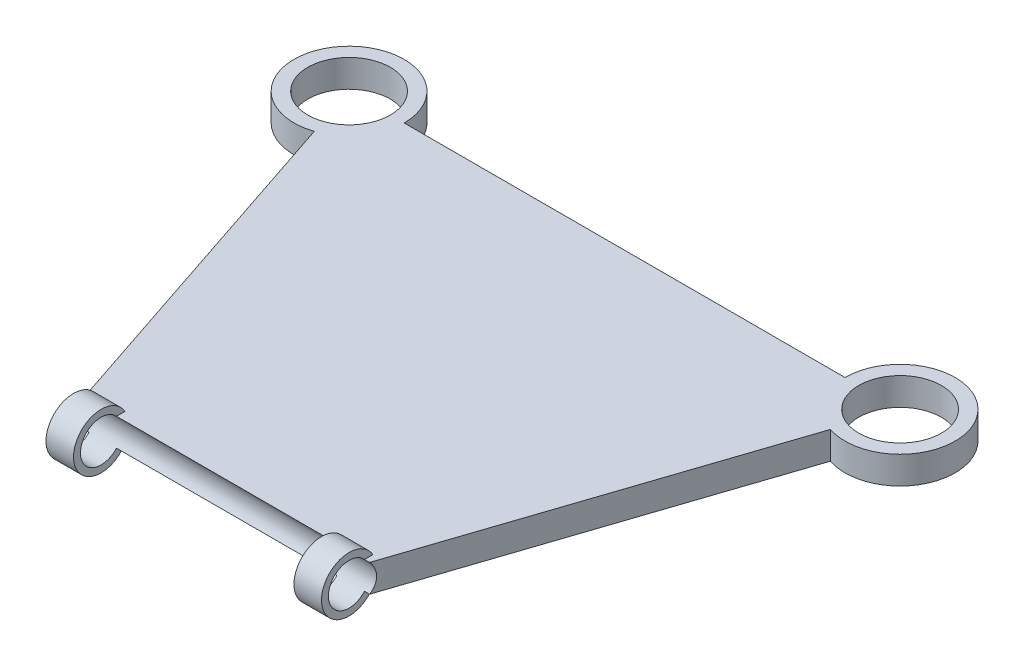
ISO-10303-21;
HEADER;
FILE_DESCRIPTION(('STEP AP214'),'2;1');
FILE_NAME('part.step','',(''),(''),'','','');
FILE_SCHEMA(('AUTOMOTIVE_DESIGN { 1 0 10303 214 1 1 1 1 }'));
ENDSEC;
DATA;
#1=APPLICATION_CONTEXT('core data for automotive mechanical design processes');
#2=APPLICATION_PROTOCOL_DEFINITION('international standard','automotive_design',2000,#1);
#3=PRODUCT_CONTEXT('',#1,'mechanical');
#4=PRODUCT('Part','Part','',(#3));
#5=PRODUCT_RELATED_PRODUCT_CATEGORY('part','',(#4));
#6=PRODUCT_DEFINITION_FORMATION('','',#4);
#7=PRODUCT_DEFINITION_CONTEXT('part definition',#1,'design');
#8=PRODUCT_DEFINITION('design','',#6,#7);
#9=PRODUCT_DEFINITION_SHAPE('','',#8);
#10=(LENGTH_UNIT() NAMED_UNIT(*) SI_UNIT(.MILLI.,.METRE.));
#11=(NAMED_UNIT(*) PLANE_ANGLE_UNIT() SI_UNIT($,.RADIAN.));
#12=(NAMED_UNIT(*) SI_UNIT($,.STERADIAN.) SOLID_ANGLE_UNIT());
#13=UNCERTAINTY_MEASURE_WITH_UNIT(LENGTH_MEASURE(1.E-05),#10,'distance_accuracy_value','');
#14=(GEOMETRIC_REPRESENTATION_CONTEXT(3) GLOBAL_UNCERTAINTY_ASSIGNED_CONTEXT((#13)) GLOBAL_UNIT_ASSIGNED_CONTEXT((#10,
#11,#12)) REPRESENTATION_CONTEXT('',''));
#15=CARTESIAN_POINT('',(0.,0.,0.));
#16=DIRECTION('',(0.,0.,1.));
#17=DIRECTION('',(1.,0.,0.));
#18=AXIS2_PLACEMENT_3D('',#15,#16,#17);
#19=CARTESIAN_POINT('',(0.,32.,0.));
#20=DIRECTION('',(0.,1.,0.));
#21=DIRECTION('',(0.,0.,1.));
#22=AXIS2_PLACEMENT_3D('',#19,#20,#21);
#23=PLANE('',#22);
#24=CARTESIAN_POINT('',(640.,32.,0.));
#25=DIRECTION('',(0.,1.,0.));
#26=DIRECTION('',(0.,0.,1.));
#27=AXIS2_PLACEMENT_3D('',#24,#25,#26);
#28=CIRCLE('',#27,48.);
#29=CARTESIAN_POINT('',(640.,32.,48.));
#30=VERTEX_POINT('',#29);
#31=EDGE_CURVE('E217',#30,#30,#28,.T.);
#32=ORIENTED_EDGE('',*,*,#31,.F.);
#33=EDGE_LOOP('',(#32));
#34=FACE_BOUND('',#33,.T.);
#35=CARTESIAN_POINT('',(0.,32.,0.));
#36=DIRECTION('',(0.,1.,0.));
#37=DIRECTION('',(0.,0.,1.));
#38=AXIS2_PLACEMENT_3D('',#35,#36,#37);
#39=CIRCLE('',#38,48.);
#40=CARTESIAN_POINT('',(0.,32.,48.));
#41=VERTEX_POINT('',#40);
#42=EDGE_CURVE('E221',#41,#41,#39,.T.);
#43=ORIENTED_EDGE('',*,*,#42,.F.);
#44=EDGE_LOOP('',(#43));
#45=FACE_BOUND('',#44,.T.);
#46=DIRECTION('',(-0.316227766016838,0.,-0.948683298050514));
#47=VECTOR('',#46,1.);
#48=CARTESIAN_POINT('',(0.,32.,0.));
#49=LINE('',#48,#47);
#50=CARTESIAN_POINT('',(154.037152060001,32.,462.111456180002));
#51=VERTEX_POINT('',#50);
#52=CARTESIAN_POINT('',(20.2385770250776,32.,60.7157310752329));
#53=VERTEX_POINT('',#52);
#54=EDGE_CURVE('E240',#51,#53,#49,.T.);
#55=ORIENTED_EDGE('',*,*,#54,.F.);
#56=DIRECTION('',(1.,0.,0.));
#57=VECTOR('',#56,1.);
#58=CARTESIAN_POINT('',(128.,32.,462.111456180002));
#59=LINE('',#58,#57);
#60=CARTESIAN_POINT('',(160.,32.,462.111456180002));
#61=VERTEX_POINT('',#60);
#62=EDGE_CURVE('E57',#51,#61,#59,.T.);
#63=ORIENTED_EDGE('',*,*,#62,.T.);
#64=DIRECTION('',(0.,0.,1.));
#65=VECTOR('',#64,1.);
#66=CARTESIAN_POINT('',(160.,32.,0.));
#67=LINE('',#66,#65);
#68=CARTESIAN_POINT('',(160.,32.,452.287187078898));
#69=VERTEX_POINT('',#68);
#70=EDGE_CURVE('E202',#69,#61,#67,.T.);
#71=ORIENTED_EDGE('',*,*,#70,.F.);
#72=DIRECTION('',(-1.,0.,0.));
#73=VECTOR('',#72,1.);
#74=CARTESIAN_POINT('',(192.,32.,452.287187078898));
#75=LINE('',#74,#73);
#76=CARTESIAN_POINT('',(192.,32.,452.287187078898));
#77=VERTEX_POINT('',#76);
#78=EDGE_CURVE('E213',#77,#69,#75,.T.);
#79=ORIENTED_EDGE('',*,*,#78,.F.);
#80=DIRECTION('',(0.,0.,1.));
#81=VECTOR('',#80,1.);
#82=CARTESIAN_POINT('',(192.,32.,0.));
#83=LINE('',#82,#81);
#84=CARTESIAN_POINT('',(192.,32.,462.111456180002));
#85=VERTEX_POINT('',#84);
#86=EDGE_CURVE('E209',#77,#85,#83,.T.);
#87=ORIENTED_EDGE('',*,*,#86,.T.);
#88=CARTESIAN_POINT('',(448.,32.,462.111456180002));
#89=VERTEX_POINT('',#88);
#90=EDGE_CURVE('E156',#85,#89,#59,.T.);
#91=ORIENTED_EDGE('',*,*,#90,.T.);
#92=DIRECTION('',(0.,0.,1.));
#93=VECTOR('',#92,1.);
#94=CARTESIAN_POINT('',(448.,32.,0.));
#95=LINE('',#94,#93);
#96=CARTESIAN_POINT('',(448.,32.,452.287187078898));
#97=VERTEX_POINT('',#96);
#98=EDGE_CURVE('E65',#97,#89,#95,.T.);
#99=ORIENTED_EDGE('',*,*,#98,.F.);
#100=DIRECTION('',(1.,0.,0.));
#101=VECTOR('',#100,1.);
#102=CARTESIAN_POINT('',(448.,32.,452.287187078898));
#103=LINE('',#102,#101);
#104=CARTESIAN_POINT('',(480.,32.,452.287187078898));
#105=VERTEX_POINT('',#104);
#106=EDGE_CURVE('E160',#97,#105,#103,.T.);
#107=ORIENTED_EDGE('',*,*,#106,.T.);
#108=DIRECTION('',(0.,0.,1.));
#109=VECTOR('',#108,1.);
#110=CARTESIAN_POINT('',(480.,32.,0.));
#111=LINE('',#110,#109);
#112=CARTESIAN_POINT('',(480.,32.,462.111456180002));
#113=VERTEX_POINT('',#112);
#114=EDGE_CURVE('E158',#105,#113,#111,.T.);
#115=ORIENTED_EDGE('',*,*,#114,.T.);
#116=CARTESIAN_POINT('',(485.96284794,32.,462.111456180002));
#117=VERTEX_POINT('',#116);
#118=EDGE_CURVE('E142',#113,#117,#59,.T.);
#119=ORIENTED_EDGE('',*,*,#118,.T.);
#120=DIRECTION('',(-0.316227766016838,0.,0.948683298050514));
#121=VECTOR('',#120,1.);
#122=CARTESIAN_POINT('',(576.,32.,192.));
#123=LINE('',#122,#121);
#124=CARTESIAN_POINT('',(619.761422974923,32.,60.7157310752329));
#125=VERTEX_POINT('',#124);
#126=EDGE_CURVE('E226',#125,#117,#123,.T.);
#127=ORIENTED_EDGE('',*,*,#126,.F.);
#128=CARTESIAN_POINT('',(640.,32.,0.));
#129=DIRECTION('',(0.,1.,0.));
#130=DIRECTION('',(0.,0.,1.));
#131=AXIS2_PLACEMENT_3D('',#128,#129,#130);
#132=CIRCLE('',#131,64.);
#133=CARTESIAN_POINT('',(576.,32.,0.));
#134=VERTEX_POINT('',#133);
#135=EDGE_CURVE('E229',#125,#134,#132,.T.);
#136=ORIENTED_EDGE('',*,*,#135,.T.);
#137=DIRECTION('',(1.,0.,0.));
#138=VECTOR('',#137,1.);
#139=CARTESIAN_POINT('',(0.,32.,0.));
#140=LINE('',#139,#138);
#141=CARTESIAN_POINT('',(64.,32.,0.));
#142=VERTEX_POINT('',#141);
#143=EDGE_CURVE('E232',#142,#134,#140,.T.);
#144=ORIENTED_EDGE('',*,*,#143,.F.);
#145=CARTESIAN_POINT('',(0.,32.,0.));
#146=DIRECTION('',(0.,1.,0.));
#147=DIRECTION('',(0.,0.,1.));
#148=AXIS2_PLACEMENT_3D('',#145,#146,#147);
#149=CIRCLE('',#148,64.);
#150=EDGE_CURVE('E236',#142,#53,#149,.T.);
#151=ORIENTED_EDGE('',*,*,#150,.T.);
#152=EDGE_LOOP('',(#55,#63,#71,#79,#87,#91,#99,#107,#115,#119,#127,#136,#144,#151));
#153=FACE_BOUND('',#152,.T.);
#154=ADVANCED_FACE('F41',(#34,#45,#153),#23,.T.);
#155=CARTESIAN_POINT('',(0.,0.,0.));
#156=DIRECTION('',(0.,1.,0.));
#157=DIRECTION('',(0.,0.,1.));
#158=AXIS2_PLACEMENT_3D('',#155,#156,#157);
#159=PLANE('',#158);
#160=CARTESIAN_POINT('',(640.,0.,0.));
#161=DIRECTION('',(0.,1.,0.));
#162=DIRECTION('',(0.,0.,1.));
#163=AXIS2_PLACEMENT_3D('',#160,#161,#162);
#164=CIRCLE('',#163,48.);
#165=CARTESIAN_POINT('',(640.,0.,48.));
#166=VERTEX_POINT('',#165);
#167=EDGE_CURVE('E216',#166,#166,#164,.T.);
#168=ORIENTED_EDGE('',*,*,#167,.T.);
#169=EDGE_LOOP('',(#168));
#170=FACE_BOUND('',#169,.T.);
#171=CARTESIAN_POINT('',(0.,0.,0.));
#172=DIRECTION('',(0.,1.,0.));
#173=DIRECTION('',(0.,0.,1.));
#174=AXIS2_PLACEMENT_3D('',#171,#172,#173);
#175=CIRCLE('',#174,48.);
#176=CARTESIAN_POINT('',(0.,0.,48.));
#177=VERTEX_POINT('',#176);
#178=EDGE_CURVE('E247',#177,#177,#175,.T.);
#179=ORIENTED_EDGE('',*,*,#178,.T.);
#180=EDGE_LOOP('',(#179));
#181=FACE_BOUND('',#180,.T.);
#182=DIRECTION('',(1.,0.,0.));
#183=VECTOR('',#182,1.);
#184=CARTESIAN_POINT('',(128.,0.,462.111456180002));
#185=LINE('',#184,#183);
#186=CARTESIAN_POINT('',(154.037152060001,0.,462.111456180002));
#187=VERTEX_POINT('',#186);
#188=CARTESIAN_POINT('',(160.,0.,462.111456180002));
#189=VERTEX_POINT('',#188);
#190=EDGE_CURVE('E177',#187,#189,#185,.T.);
#191=ORIENTED_EDGE('',*,*,#190,.F.);
#192=DIRECTION('',(-0.316227766016838,0.,-0.948683298050514));
#193=VECTOR('',#192,1.);
#194=CARTESIAN_POINT('',(0.,0.,0.));
#195=LINE('',#194,#193);
#196=CARTESIAN_POINT('',(20.2385770250776,0.,60.7157310752329));
#197=VERTEX_POINT('',#196);
#198=EDGE_CURVE('E222',#187,#197,#195,.T.);
#199=ORIENTED_EDGE('',*,*,#198,.T.);
#200=CARTESIAN_POINT('',(0.,0.,0.));
#201=DIRECTION('',(0.,1.,0.));
#202=DIRECTION('',(0.,0.,1.));
#203=AXIS2_PLACEMENT_3D('',#200,#201,#202);
#204=CIRCLE('',#203,64.);
#205=CARTESIAN_POINT('',(64.,0.,0.));
#206=VERTEX_POINT('',#205);
#207=EDGE_CURVE('E263',#206,#197,#204,.T.);
#208=ORIENTED_EDGE('',*,*,#207,.F.);
#209=DIRECTION('',(1.,0.,0.));
#210=VECTOR('',#209,1.);
#211=CARTESIAN_POINT('',(0.,0.,0.));
#212=LINE('',#211,#210);
#213=CARTESIAN_POINT('',(576.,0.,0.));
#214=VERTEX_POINT('',#213);
#215=EDGE_CURVE('E259',#206,#214,#212,.T.);
#216=ORIENTED_EDGE('',*,*,#215,.T.);
#217=CARTESIAN_POINT('',(640.,0.,0.));
#218=DIRECTION('',(0.,1.,0.));
#219=DIRECTION('',(0.,0.,1.));
#220=AXIS2_PLACEMENT_3D('',#217,#218,#219);
#221=CIRCLE('',#220,64.);
#222=CARTESIAN_POINT('',(619.761422974923,0.,60.7157310752329));
#223=VERTEX_POINT('',#222);
#224=EDGE_CURVE('E255',#223,#214,#221,.T.);
#225=ORIENTED_EDGE('',*,*,#224,.F.);
#226=DIRECTION('',(-0.316227766016838,0.,0.948683298050514));
#227=VECTOR('',#226,1.);
#228=CARTESIAN_POINT('',(576.,0.,192.));
#229=LINE('',#228,#227);
#230=CARTESIAN_POINT('',(485.96284794,0.,462.111456180002));
#231=VERTEX_POINT('',#230);
#232=EDGE_CURVE('E251',#223,#231,#229,.T.);
#233=ORIENTED_EDGE('',*,*,#232,.T.);
#234=CARTESIAN_POINT('',(480.,0.,462.111456180002));
#235=VERTEX_POINT('',#234);
#236=EDGE_CURVE('E154',#235,#231,#185,.T.);
#237=ORIENTED_EDGE('',*,*,#236,.F.);
#238=DIRECTION('',(0.,0.,1.));
#239=VECTOR('',#238,1.);
#240=CARTESIAN_POINT('',(480.,0.,0.));
#241=LINE('',#240,#239);
#242=CARTESIAN_POINT('',(480.,0.,452.287187078898));
#243=VERTEX_POINT('',#242);
#244=EDGE_CURVE('E168',#243,#235,#241,.T.);
#245=ORIENTED_EDGE('',*,*,#244,.F.);
#246=DIRECTION('',(1.,0.,0.));
#247=VECTOR('',#246,1.);
#248=CARTESIAN_POINT('',(448.,0.,452.287187078898));
#249=LINE('',#248,#247);
#250=CARTESIAN_POINT('',(448.,0.,452.287187078898));
#251=VERTEX_POINT('',#250);
#252=EDGE_CURVE('E11',#251,#243,#249,.T.);
#253=ORIENTED_EDGE('',*,*,#252,.F.);
#254=DIRECTION('',(0.,0.,1.));
#255=VECTOR('',#254,1.);
#256=CARTESIAN_POINT('',(448.,0.,0.));
#257=LINE('',#256,#255);
#258=CARTESIAN_POINT('',(448.,0.,462.111456180002));
#259=VERTEX_POINT('',#258);
#260=EDGE_CURVE('E50',#251,#259,#257,.T.);
#261=ORIENTED_EDGE('',*,*,#260,.T.);
#262=CARTESIAN_POINT('',(192.,0.,462.111456180002));
#263=VERTEX_POINT('',#262);
#264=EDGE_CURVE('E299',#263,#259,#185,.T.);
#265=ORIENTED_EDGE('',*,*,#264,.F.);
#266=DIRECTION('',(0.,0.,1.));
#267=VECTOR('',#266,1.);
#268=CARTESIAN_POINT('',(192.,0.,0.));
#269=LINE('',#268,#267);
#270=CARTESIAN_POINT('',(192.,0.,452.287187078898));
#271=VERTEX_POINT('',#270);
#272=EDGE_CURVE('E285',#271,#263,#269,.T.);
#273=ORIENTED_EDGE('',*,*,#272,.F.);
#274=DIRECTION('',(-1.,0.,0.));
#275=VECTOR('',#274,1.);
#276=CARTESIAN_POINT('',(192.,0.,452.287187078898));
#277=LINE('',#276,#275);
#278=CARTESIAN_POINT('',(160.,0.,452.287187078898));
#279=VERTEX_POINT('',#278);
#280=EDGE_CURVE('E289',#271,#279,#277,.T.);
#281=ORIENTED_EDGE('',*,*,#280,.T.);
#282=DIRECTION('',(0.,0.,1.));
#283=VECTOR('',#282,1.);
#284=CARTESIAN_POINT('',(160.,0.,0.));
#285=LINE('',#284,#283);
#286=EDGE_CURVE('E281',#279,#189,#285,.T.);
#287=ORIENTED_EDGE('',*,*,#286,.T.);
#288=EDGE_LOOP('',(#191,#199,#208,#216,#225,#233,#237,#245,#253,#261,#265,#273,#281,#287));
#289=FACE_BOUND('',#288,.T.);
#290=ADVANCED_FACE('F298',(#170,#181,#289),#159,.F.);
#291=CARTESIAN_POINT('',(576.,32.,192.));
#292=DIRECTION('',(0.948683298050514,0.,0.316227766016838));
#293=DIRECTION('',(0.316227766016838,0.,-0.948683298050514));
#294=AXIS2_PLACEMENT_3D('',#291,#292,#293);
#295=PLANE('',#294);
#296=ORIENTED_EDGE('',*,*,#126,.T.);
#297=CARTESIAN_POINT('',(480.,16.,480.));
#298=DIRECTION('',(0.948683298050514,0.,0.316227766016838));
#299=DIRECTION('',(0.316227766016838,0.,-0.948683298050514));
#300=AXIS2_PLACEMENT_3D('',#297,#298,#299);
#301=ELLIPSE('',#300,25.298221281347,24.);
#302=EDGE_CURVE('E150',#117,#231,#301,.F.);
#303=ORIENTED_EDGE('',*,*,#302,.T.);
#304=ORIENTED_EDGE('',*,*,#232,.F.);
#305=DIRECTION('',(0.,-1.,0.));
#306=VECTOR('',#305,1.);
#307=CARTESIAN_POINT('',(619.761422974923,32.,60.7157310752329));
#308=LINE('',#307,#306);
#309=EDGE_CURVE('E278',#125,#223,#308,.T.);
#310=ORIENTED_EDGE('',*,*,#309,.F.);
#311=EDGE_LOOP('',(#296,#303,#304,#310));
#312=FACE_BOUND('',#311,.T.);
#313=ADVANCED_FACE('F336',(#312),#295,.T.);
#314=CARTESIAN_POINT('',(640.,32.,0.));
#315=DIRECTION('',(0.,-1.,0.));
#316=DIRECTION('',(0.,0.,-1.));
#317=AXIS2_PLACEMENT_3D('',#314,#315,#316);
#318=CYLINDRICAL_SURFACE('',#317,64.);
#319=ORIENTED_EDGE('',*,*,#224,.T.);
#320=DIRECTION('',(0.,-1.,0.));
#321=VECTOR('',#320,1.);
#322=CARTESIAN_POINT('',(576.,32.,0.));
#323=LINE('',#322,#321);
#324=EDGE_CURVE('E275',#134,#214,#323,.T.);
#325=ORIENTED_EDGE('',*,*,#324,.F.);
#326=ORIENTED_EDGE('',*,*,#135,.F.);
#327=ORIENTED_EDGE('',*,*,#309,.T.);
#328=EDGE_LOOP('',(#319,#325,#326,#327));
#329=FACE_BOUND('',#328,.T.);
#330=ADVANCED_FACE('F335',(#329),#318,.T.);
#331=CARTESIAN_POINT('',(0.,32.,0.));
#332=DIRECTION('',(0.,0.,-1.));
#333=DIRECTION('',(-1.,0.,0.));
#334=AXIS2_PLACEMENT_3D('',#331,#332,#333);
#335=PLANE('',#334);
#336=ORIENTED_EDGE('',*,*,#215,.F.);
#337=DIRECTION('',(0.,-1.,0.));
#338=VECTOR('',#337,1.);
#339=CARTESIAN_POINT('',(64.,32.,0.));
#340=LINE('',#339,#338);
#341=EDGE_CURVE('E272',#142,#206,#340,.T.);
#342=ORIENTED_EDGE('',*,*,#341,.F.);
#343=ORIENTED_EDGE('',*,*,#143,.T.);
#344=ORIENTED_EDGE('',*,*,#324,.T.);
#345=EDGE_LOOP('',(#336,#342,#343,#344));
#346=FACE_BOUND('',#345,.T.);
#347=ADVANCED_FACE('F331',(#346),#335,.T.);
#348=CARTESIAN_POINT('',(0.,32.,0.));
#349=DIRECTION('',(0.,-1.,0.));
#350=DIRECTION('',(0.,0.,-1.));
#351=AXIS2_PLACEMENT_3D('',#348,#349,#350);
#352=CYLINDRICAL_SURFACE('',#351,64.);
#353=ORIENTED_EDGE('',*,*,#207,.T.);
#354=DIRECTION('',(0.,-1.,0.));
#355=VECTOR('',#354,1.);
#356=CARTESIAN_POINT('',(20.2385770250776,32.,60.7157310752329));
#357=LINE('',#356,#355);
#358=EDGE_CURVE('E243',#53,#197,#357,.T.);
#359=ORIENTED_EDGE('',*,*,#358,.F.);
#360=ORIENTED_EDGE('',*,*,#150,.F.);
#361=ORIENTED_EDGE('',*,*,#341,.T.);
#362=EDGE_LOOP('',(#353,#359,#360,#361));
#363=FACE_BOUND('',#362,.T.);
#364=ADVANCED_FACE('F327',(#363),#352,.T.);
#365=CARTESIAN_POINT('',(0.,32.,0.));
#366=DIRECTION('',(-0.948683298050514,0.,0.316227766016838));
#367=DIRECTION('',(0.316227766016838,0.,0.948683298050514));
#368=AXIS2_PLACEMENT_3D('',#365,#366,#367);
#369=PLANE('',#368);
#370=ORIENTED_EDGE('',*,*,#198,.F.);
#371=CARTESIAN_POINT('',(160.,16.,480.));
#372=DIRECTION('',(-0.948683298050514,0.,0.316227766016838));
#373=DIRECTION('',(0.316227766016838,0.,0.948683298050514));
#374=AXIS2_PLACEMENT_3D('',#371,#372,#373);
#375=ELLIPSE('',#374,25.298221281347,24.);
#376=EDGE_CURVE('E311',#187,#51,#375,.F.);
#377=ORIENTED_EDGE('',*,*,#376,.T.);
#378=ORIENTED_EDGE('',*,*,#54,.T.);
#379=ORIENTED_EDGE('',*,*,#358,.T.);
#380=EDGE_LOOP('',(#370,#377,#378,#379));
#381=FACE_BOUND('',#380,.T.);
#382=ADVANCED_FACE('F321',(#381),#369,.T.);
#383=CARTESIAN_POINT('',(0.,32.,0.));
#384=DIRECTION('',(0.,-1.,0.));
#385=DIRECTION('',(0.,0.,-1.));
#386=AXIS2_PLACEMENT_3D('',#383,#384,#385);
#387=CYLINDRICAL_SURFACE('',#386,48.);
#388=ORIENTED_EDGE('',*,*,#42,.T.);
#389=EDGE_LOOP('',(#388));
#390=FACE_BOUND('',#389,.T.);
#391=ORIENTED_EDGE('',*,*,#178,.F.);
#392=EDGE_LOOP('',(#391));
#393=FACE_BOUND('',#392,.T.);
#394=ADVANCED_FACE('F360',(#390,#393),#387,.F.);
#395=CARTESIAN_POINT('',(640.,32.,0.));
#396=DIRECTION('',(0.,-1.,0.));
#397=DIRECTION('',(0.,0.,-1.));
#398=AXIS2_PLACEMENT_3D('',#395,#396,#397);
#399=CYLINDRICAL_SURFACE('',#398,48.);
#400=ORIENTED_EDGE('',*,*,#31,.T.);
#401=EDGE_LOOP('',(#400));
#402=FACE_BOUND('',#401,.T.);
#403=ORIENTED_EDGE('',*,*,#167,.F.);
#404=EDGE_LOOP('',(#403));
#405=FACE_BOUND('',#404,.T.);
#406=ADVANCED_FACE('F43',(#402,#405),#399,.F.);
#407=CARTESIAN_POINT('',(192.,16.,480.));
#408=DIRECTION('',(-1.,0.,0.));
#409=DIRECTION('',(0.,0.,1.));
#410=AXIS2_PLACEMENT_3D('',#407,#408,#409);
#411=CYLINDRICAL_SURFACE('',#410,32.);
#412=CARTESIAN_POINT('',(192.,16.,480.));
#413=DIRECTION('',(-1.,0.,0.));
#414=DIRECTION('',(0.,0.,1.));
#415=AXIS2_PLACEMENT_3D('',#412,#413,#414);
#416=CIRCLE('',#415,32.);
#417=EDGE_CURVE('E198',#271,#77,#416,.T.);
#418=ORIENTED_EDGE('',*,*,#417,.T.);
#419=ORIENTED_EDGE('',*,*,#78,.T.);
#420=CARTESIAN_POINT('',(160.,16.,480.));
#421=DIRECTION('',(-1.,0.,0.));
#422=DIRECTION('',(0.,0.,1.));
#423=AXIS2_PLACEMENT_3D('',#420,#421,#422);
#424=CIRCLE('',#423,32.);
#425=EDGE_CURVE('E195',#279,#69,#424,.T.);
#426=ORIENTED_EDGE('',*,*,#425,.F.);
#427=ORIENTED_EDGE('',*,*,#280,.F.);
#428=EDGE_LOOP('',(#418,#419,#426,#427));
#429=FACE_BOUND('',#428,.T.);
#430=ADVANCED_FACE('F356',(#429),#411,.T.);
#431=CARTESIAN_POINT('',(192.,16.,480.));
#432=DIRECTION('',(-1.,0.,0.));
#433=DIRECTION('',(0.,0.,1.));
#434=AXIS2_PLACEMENT_3D('',#431,#432,#433);
#435=PLANE('',#434);
#436=ORIENTED_EDGE('',*,*,#86,.F.);
#437=ORIENTED_EDGE('',*,*,#417,.F.);
#438=ORIENTED_EDGE('',*,*,#272,.T.);
#439=CARTESIAN_POINT('',(192.,16.,480.));
#440=DIRECTION('',(-1.,0.,0.));
#441=DIRECTION('',(0.,0.,1.));
#442=AXIS2_PLACEMENT_3D('',#439,#440,#441);
#443=CIRCLE('',#442,24.);
#444=EDGE_CURVE('E191',#263,#85,#443,.T.);
#445=ORIENTED_EDGE('',*,*,#444,.T.);
#446=EDGE_LOOP('',(#436,#437,#438,#445));
#447=FACE_BOUND('',#446,.T.);
#448=ADVANCED_FACE('F411',(#447),#435,.F.);
#449=CARTESIAN_POINT('',(160.,16.,480.));
#450=DIRECTION('',(-1.,0.,0.));
#451=DIRECTION('',(0.,0.,1.));
#452=AXIS2_PLACEMENT_3D('',#449,#450,#451);
#453=PLANE('',#452);
#454=ORIENTED_EDGE('',*,*,#425,.T.);
#455=ORIENTED_EDGE('',*,*,#70,.T.);
#456=CARTESIAN_POINT('',(160.,16.,480.));
#457=DIRECTION('',(-1.,0.,0.));
#458=DIRECTION('',(0.,0.,1.));
#459=AXIS2_PLACEMENT_3D('',#456,#457,#458);
#460=CIRCLE('',#459,24.);
#461=EDGE_CURVE('E190',#189,#61,#460,.T.);
#462=ORIENTED_EDGE('',*,*,#461,.F.);
#463=ORIENTED_EDGE('',*,*,#286,.F.);
#464=EDGE_LOOP('',(#454,#455,#462,#463));
#465=FACE_BOUND('',#464,.T.);
#466=ADVANCED_FACE('F417',(#465),#453,.T.);
#467=CARTESIAN_POINT('',(192.,16.,480.));
#468=DIRECTION('',(-1.,0.,0.));
#469=DIRECTION('',(0.,0.,1.));
#470=AXIS2_PLACEMENT_3D('',#467,#468,#469);
#471=CYLINDRICAL_SURFACE('',#470,24.);
#472=ORIENTED_EDGE('',*,*,#461,.T.);
#473=ORIENTED_EDGE('',*,*,#62,.F.);
#474=ORIENTED_EDGE('',*,*,#376,.F.);
#475=ORIENTED_EDGE('',*,*,#190,.T.);
#476=EDGE_LOOP('',(#472,#473,#474,#475));
#477=FACE_BOUND('',#476,.T.);
#478=ORIENTED_EDGE('',*,*,#118,.F.);
#479=CARTESIAN_POINT('',(480.,16.,480.));
#480=DIRECTION('',(-1.,0.,0.));
#481=DIRECTION('',(0.,0.,1.));
#482=AXIS2_PLACEMENT_3D('',#479,#480,#481);
#483=CIRCLE('',#482,24.0000000000001);
#484=EDGE_CURVE('E147',#235,#113,#483,.T.);
#485=ORIENTED_EDGE('',*,*,#484,.F.);
#486=ORIENTED_EDGE('',*,*,#236,.T.);
#487=ORIENTED_EDGE('',*,*,#302,.F.);
#488=EDGE_LOOP('',(#478,#485,#486,#487));
#489=FACE_BOUND('',#488,.T.);
#490=ORIENTED_EDGE('',*,*,#90,.F.);
#491=ORIENTED_EDGE('',*,*,#444,.F.);
#492=ORIENTED_EDGE('',*,*,#264,.T.);
#493=CARTESIAN_POINT('',(448.,16.,480.));
#494=DIRECTION('',(-1.,0.,0.));
#495=DIRECTION('',(0.,0.,1.));
#496=AXIS2_PLACEMENT_3D('',#493,#494,#495);
#497=CIRCLE('',#496,24.0000000000001);
#498=EDGE_CURVE('E170',#259,#89,#497,.T.);
#499=ORIENTED_EDGE('',*,*,#498,.T.);
#500=EDGE_LOOP('',(#490,#491,#492,#499));
#501=FACE_BOUND('',#500,.T.);
#502=ADVANCED_FACE('F144',(#477,#489,#501),#471,.F.);
#503=CARTESIAN_POINT('',(448.,16.,480.));
#504=DIRECTION('',(-1.,0.,0.));
#505=DIRECTION('',(0.,0.,1.));
#506=AXIS2_PLACEMENT_3D('',#503,#504,#505);
#507=PLANE('',#506);
#508=CARTESIAN_POINT('',(448.,16.,480.));
#509=DIRECTION('',(-1.,0.,0.));
#510=DIRECTION('',(0.,0.,1.));
#511=AXIS2_PLACEMENT_3D('',#508,#509,#510);
#512=CIRCLE('',#511,32.0000000000001);
#513=EDGE_CURVE('E180',#251,#97,#512,.T.);
#514=ORIENTED_EDGE('',*,*,#513,.T.);
#515=ORIENTED_EDGE('',*,*,#98,.T.);
#516=ORIENTED_EDGE('',*,*,#498,.F.);
#517=ORIENTED_EDGE('',*,*,#260,.F.);
#518=EDGE_LOOP('',(#514,#515,#516,#517));
#519=FACE_BOUND('',#518,.T.);
#520=ADVANCED_FACE('F303',(#519),#507,.T.);
#521=CARTESIAN_POINT('',(480.,16.,480.));
#522=DIRECTION('',(-1.,0.,0.));
#523=DIRECTION('',(0.,0.,1.));
#524=AXIS2_PLACEMENT_3D('',#521,#522,#523);
#525=PLANE('',#524);
#526=ORIENTED_EDGE('',*,*,#114,.F.);
#527=CARTESIAN_POINT('',(480.,16.,480.));
#528=DIRECTION('',(-1.,0.,0.));
#529=DIRECTION('',(0.,0.,1.));
#530=AXIS2_PLACEMENT_3D('',#527,#528,#529);
#531=CIRCLE('',#530,32.0000000000001);
#532=EDGE_CURVE('E175',#243,#105,#531,.T.);
#533=ORIENTED_EDGE('',*,*,#532,.F.);
#534=ORIENTED_EDGE('',*,*,#244,.T.);
#535=ORIENTED_EDGE('',*,*,#484,.T.);
#536=EDGE_LOOP('',(#526,#533,#534,#535));
#537=FACE_BOUND('',#536,.T.);
#538=ADVANCED_FACE('F166',(#537),#525,.F.);
#539=CARTESIAN_POINT('',(448.,16.,480.));
#540=DIRECTION('',(1.,0.,0.));
#541=DIRECTION('',(0.,0.,-1.));
#542=AXIS2_PLACEMENT_3D('',#539,#540,#541);
#543=CYLINDRICAL_SURFACE('',#542,32.0000000000001);
#544=ORIENTED_EDGE('',*,*,#106,.F.);
#545=ORIENTED_EDGE('',*,*,#513,.F.);
#546=ORIENTED_EDGE('',*,*,#252,.T.);
#547=ORIENTED_EDGE('',*,*,#532,.T.);
#548=EDGE_LOOP('',(#544,#545,#546,#547));
#549=FACE_BOUND('',#548,.T.);
#550=ADVANCED_FACE('F305',(#549),#543,.T.);
#551=CLOSED_SHELL('',(#154,#290,#313,#330,#347,#364,#382,#394,#406,#430,#448,#466,#502,#520,
#538,#550));
#552=MANIFOLD_SOLID_BREP('B2',#551);
#553=ADVANCED_BREP_SHAPE_REPRESENTATION('',(#18,#552),#14);
#554=SHAPE_DEFINITION_REPRESENTATION(#9,#553);
ENDSEC;
END-ISO-10303-21;
